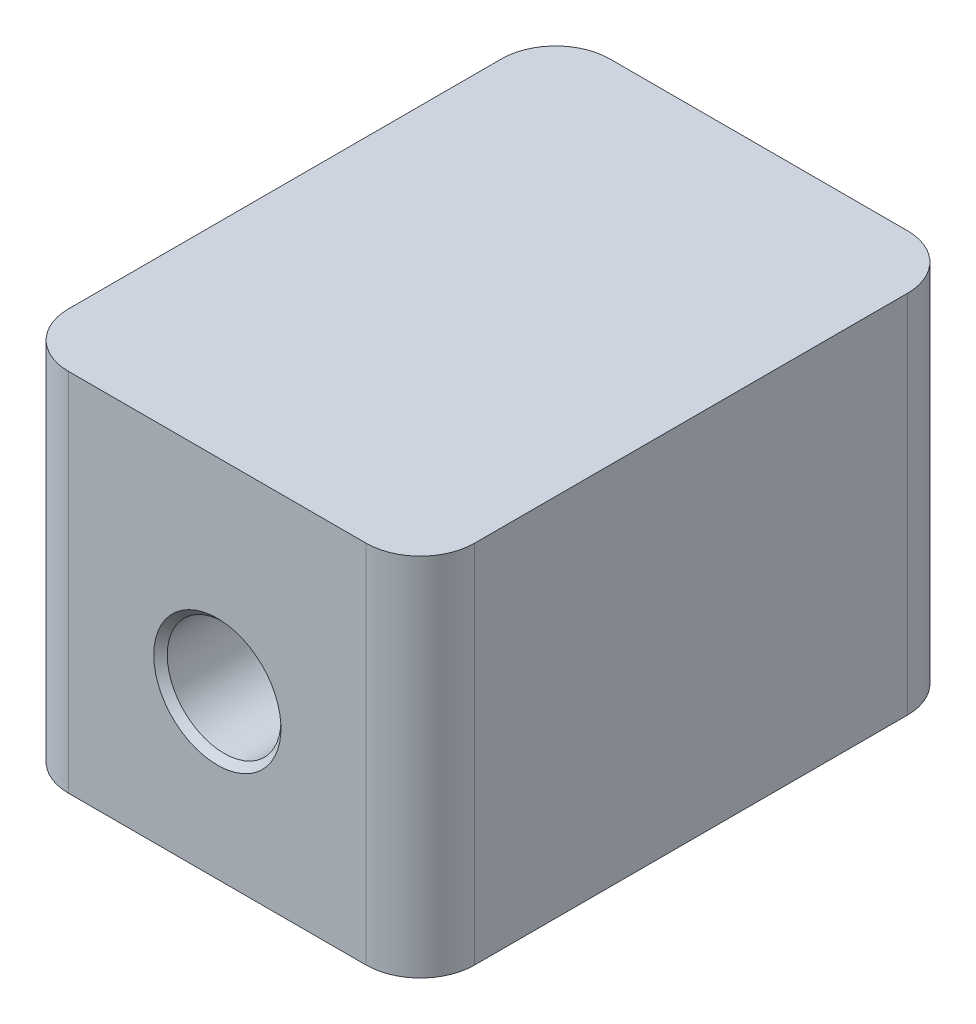
ISO-10303-21;
HEADER;
FILE_DESCRIPTION(('STEP AP214'),'2;1');
FILE_NAME('part.step','',(''),(''),'','','');
FILE_SCHEMA(('AUTOMOTIVE_DESIGN { 1 0 10303 214 1 1 1 1 }'));
ENDSEC;
DATA;
#1=APPLICATION_CONTEXT('core data for automotive mechanical design processes');
#2=APPLICATION_PROTOCOL_DEFINITION('international standard','automotive_design',2000,#1);
#3=PRODUCT_CONTEXT('',#1,'mechanical');
#4=PRODUCT('Part','Part','',(#3));
#5=PRODUCT_RELATED_PRODUCT_CATEGORY('part','',(#4));
#6=PRODUCT_DEFINITION_FORMATION('','',#4);
#7=PRODUCT_DEFINITION_CONTEXT('part definition',#1,'design');
#8=PRODUCT_DEFINITION('design','',#6,#7);
#9=PRODUCT_DEFINITION_SHAPE('','',#8);
#10=(LENGTH_UNIT() NAMED_UNIT(*) SI_UNIT(.MILLI.,.METRE.));
#11=(NAMED_UNIT(*) PLANE_ANGLE_UNIT() SI_UNIT($,.RADIAN.));
#12=(NAMED_UNIT(*) SI_UNIT($,.STERADIAN.) SOLID_ANGLE_UNIT());
#13=UNCERTAINTY_MEASURE_WITH_UNIT(LENGTH_MEASURE(1.E-05),#10,'distance_accuracy_value','');
#14=(GEOMETRIC_REPRESENTATION_CONTEXT(3) GLOBAL_UNCERTAINTY_ASSIGNED_CONTEXT((#13)) GLOBAL_UNIT_ASSIGNED_CONTEXT((#10,
#11,#12)) REPRESENTATION_CONTEXT('',''));
#15=CARTESIAN_POINT('',(0.,0.,0.));
#16=DIRECTION('',(0.,0.,1.));
#17=DIRECTION('',(1.,0.,0.));
#18=AXIS2_PLACEMENT_3D('',#15,#16,#17);
#19=CARTESIAN_POINT('',(7.5,-6.,10.));
#20=DIRECTION('',(-1.,0.,0.));
#21=DIRECTION('',(0.,0.,1.));
#22=AXIS2_PLACEMENT_3D('',#19,#20,#21);
#23=PLANE('',#22);
#24=DIRECTION('',(0.,0.,-1.));
#25=VECTOR('',#24,1.);
#26=CARTESIAN_POINT('',(7.5,-6.,10.));
#27=LINE('',#26,#25);
#28=CARTESIAN_POINT('',(7.5,-6.,8.));
#29=VERTEX_POINT('',#28);
#30=CARTESIAN_POINT('',(7.5,-6.,-8.));
#31=VERTEX_POINT('',#30);
#32=EDGE_CURVE('E124',#29,#31,#27,.T.);
#33=ORIENTED_EDGE('',*,*,#32,.T.);
#34=DIRECTION('',(0.,1.,0.));
#35=VECTOR('',#34,1.);
#36=CARTESIAN_POINT('',(7.5,7.5,-8.));
#37=LINE('',#36,#35);
#38=CARTESIAN_POINT('',(7.5,7.5,-8.));
#39=VERTEX_POINT('',#38);
#40=EDGE_CURVE('E151',#31,#39,#37,.T.);
#41=ORIENTED_EDGE('',*,*,#40,.T.);
#42=DIRECTION('',(0.,0.,-1.));
#43=VECTOR('',#42,1.);
#44=CARTESIAN_POINT('',(7.5,7.5,10.));
#45=LINE('',#44,#43);
#46=CARTESIAN_POINT('',(7.5,7.5,8.));
#47=VERTEX_POINT('',#46);
#48=EDGE_CURVE('E129',#47,#39,#45,.T.);
#49=ORIENTED_EDGE('',*,*,#48,.F.);
#50=DIRECTION('',(0.,1.,0.));
#51=VECTOR('',#50,1.);
#52=CARTESIAN_POINT('',(7.5,-6.,8.));
#53=LINE('',#52,#51);
#54=EDGE_CURVE('E149',#47,#29,#53,.F.);
#55=ORIENTED_EDGE('',*,*,#54,.T.);
#56=EDGE_LOOP('',(#33,#41,#49,#55));
#57=FACE_BOUND('',#56,.T.);
#58=ADVANCED_FACE('F36',(#57),#23,.F.);
#59=CARTESIAN_POINT('',(-7.5,7.5,10.));
#60=DIRECTION('',(0.,-1.,0.));
#61=DIRECTION('',(0.,0.,-1.));
#62=AXIS2_PLACEMENT_3D('',#59,#60,#61);
#63=PLANE('',#62);
#64=DIRECTION('',(-1.,0.,0.));
#65=VECTOR('',#64,1.);
#66=CARTESIAN_POINT('',(-7.5,7.5,-10.));
#67=LINE('',#66,#65);
#68=CARTESIAN_POINT('',(5.5,7.5,-10.));
#69=VERTEX_POINT('',#68);
#70=CARTESIAN_POINT('',(-5.5,7.5,-10.));
#71=VERTEX_POINT('',#70);
#72=EDGE_CURVE('E206',#69,#71,#67,.T.);
#73=ORIENTED_EDGE('',*,*,#72,.T.);
#74=CARTESIAN_POINT('',(-5.5,7.5,-8.));
#75=DIRECTION('',(0.,-1.,0.));
#76=DIRECTION('',(0.,0.,-1.));
#77=AXIS2_PLACEMENT_3D('',#74,#75,#76);
#78=CIRCLE('',#77,2.);
#79=CARTESIAN_POINT('',(-7.5,7.5,-8.));
#80=VERTEX_POINT('',#79);
#81=EDGE_CURVE('E147',#71,#80,#78,.F.);
#82=ORIENTED_EDGE('',*,*,#81,.T.);
#83=DIRECTION('',(0.,0.,-1.));
#84=VECTOR('',#83,1.);
#85=CARTESIAN_POINT('',(-7.5,7.5,10.));
#86=LINE('',#85,#84);
#87=CARTESIAN_POINT('',(-7.5,7.5,8.));
#88=VERTEX_POINT('',#87);
#89=EDGE_CURVE('E123',#88,#80,#86,.T.);
#90=ORIENTED_EDGE('',*,*,#89,.F.);
#91=CARTESIAN_POINT('',(-5.5,7.5,8.));
#92=DIRECTION('',(0.,-1.,0.));
#93=DIRECTION('',(0.,0.,-1.));
#94=AXIS2_PLACEMENT_3D('',#91,#92,#93);
#95=CIRCLE('',#94,2.);
#96=CARTESIAN_POINT('',(-5.5,7.5,10.));
#97=VERTEX_POINT('',#96);
#98=EDGE_CURVE('E128',#88,#97,#95,.F.);
#99=ORIENTED_EDGE('',*,*,#98,.T.);
#100=DIRECTION('',(-1.,0.,0.));
#101=VECTOR('',#100,1.);
#102=CARTESIAN_POINT('',(-7.5,7.5,10.));
#103=LINE('',#102,#101);
#104=CARTESIAN_POINT('',(5.5,7.5,10.));
#105=VERTEX_POINT('',#104);
#106=EDGE_CURVE('E207',#105,#97,#103,.T.);
#107=ORIENTED_EDGE('',*,*,#106,.F.);
#108=CARTESIAN_POINT('',(5.5,7.5,8.));
#109=DIRECTION('',(0.,-1.,0.));
#110=DIRECTION('',(0.,0.,-1.));
#111=AXIS2_PLACEMENT_3D('',#108,#109,#110);
#112=CIRCLE('',#111,2.);
#113=EDGE_CURVE('E59',#105,#47,#112,.F.);
#114=ORIENTED_EDGE('',*,*,#113,.T.);
#115=ORIENTED_EDGE('',*,*,#48,.T.);
#116=CARTESIAN_POINT('',(5.5,7.5,-8.));
#117=DIRECTION('',(0.,-1.,0.));
#118=DIRECTION('',(0.,0.,-1.));
#119=AXIS2_PLACEMENT_3D('',#116,#117,#118);
#120=CIRCLE('',#119,2.);
#121=EDGE_CURVE('E51',#39,#69,#120,.F.);
#122=ORIENTED_EDGE('',*,*,#121,.T.);
#123=EDGE_LOOP('',(#73,#82,#90,#99,#107,#114,#115,#122));
#124=FACE_BOUND('',#123,.T.);
#125=ADVANCED_FACE('F236',(#124),#63,.F.);
#126=CARTESIAN_POINT('',(-7.5,-6.,10.));
#127=DIRECTION('',(1.,0.,0.));
#128=DIRECTION('',(0.,0.,-1.));
#129=AXIS2_PLACEMENT_3D('',#126,#127,#128);
#130=PLANE('',#129);
#131=ORIENTED_EDGE('',*,*,#89,.T.);
#132=DIRECTION('',(0.,-1.,0.));
#133=VECTOR('',#132,1.);
#134=CARTESIAN_POINT('',(-7.5,-6.,-8.));
#135=LINE('',#134,#133);
#136=CARTESIAN_POINT('',(-7.5,-6.,-8.));
#137=VERTEX_POINT('',#136);
#138=EDGE_CURVE('E114',#80,#137,#135,.T.);
#139=ORIENTED_EDGE('',*,*,#138,.T.);
#140=DIRECTION('',(0.,0.,-1.));
#141=VECTOR('',#140,1.);
#142=CARTESIAN_POINT('',(-7.5,-6.,10.));
#143=LINE('',#142,#141);
#144=CARTESIAN_POINT('',(-7.5,-6.,8.));
#145=VERTEX_POINT('',#144);
#146=EDGE_CURVE('E106',#145,#137,#143,.T.);
#147=ORIENTED_EDGE('',*,*,#146,.F.);
#148=DIRECTION('',(0.,-1.,0.));
#149=VECTOR('',#148,1.);
#150=CARTESIAN_POINT('',(-7.5,-6.,8.));
#151=LINE('',#150,#149);
#152=EDGE_CURVE('E120',#145,#88,#151,.F.);
#153=ORIENTED_EDGE('',*,*,#152,.T.);
#154=EDGE_LOOP('',(#131,#139,#147,#153));
#155=FACE_BOUND('',#154,.T.);
#156=ADVANCED_FACE('F119',(#155),#130,.F.);
#157=CARTESIAN_POINT('',(-7.5,-6.,10.));
#158=DIRECTION('',(0.,1.,0.));
#159=DIRECTION('',(0.,0.,1.));
#160=AXIS2_PLACEMENT_3D('',#157,#158,#159);
#161=PLANE('',#160);
#162=CARTESIAN_POINT('',(5.5,-6.,0.));
#163=DIRECTION('',(0.,1.,0.));
#164=DIRECTION('',(0.,0.,1.));
#165=AXIS2_PLACEMENT_3D('',#162,#163,#164);
#166=CIRCLE('',#165,1.4);
#167=CARTESIAN_POINT('',(5.5,-6.,1.4));
#168=VERTEX_POINT('',#167);
#169=EDGE_CURVE('E44',#168,#168,#166,.T.);
#170=ORIENTED_EDGE('',*,*,#169,.T.);
#171=EDGE_LOOP('',(#170));
#172=FACE_BOUND('',#171,.T.);
#173=CARTESIAN_POINT('',(-5.5,-6.,0.));
#174=DIRECTION('',(0.,1.,0.));
#175=DIRECTION('',(0.,0.,1.));
#176=AXIS2_PLACEMENT_3D('',#173,#174,#175);
#177=CIRCLE('',#176,1.4);
#178=CARTESIAN_POINT('',(-5.5,-6.,1.4));
#179=VERTEX_POINT('',#178);
#180=EDGE_CURVE('E173',#179,#179,#177,.T.);
#181=ORIENTED_EDGE('',*,*,#180,.T.);
#182=EDGE_LOOP('',(#181));
#183=FACE_BOUND('',#182,.T.);
#184=ORIENTED_EDGE('',*,*,#146,.T.);
#185=CARTESIAN_POINT('',(-5.5,-6.,-8.));
#186=DIRECTION('',(0.,1.,0.));
#187=DIRECTION('',(0.,0.,1.));
#188=AXIS2_PLACEMENT_3D('',#185,#186,#187);
#189=CIRCLE('',#188,2.);
#190=CARTESIAN_POINT('',(-5.5,-6.,-10.));
#191=VERTEX_POINT('',#190);
#192=EDGE_CURVE('E138',#137,#191,#189,.F.);
#193=ORIENTED_EDGE('',*,*,#192,.T.);
#194=DIRECTION('',(1.,0.,0.));
#195=VECTOR('',#194,1.);
#196=CARTESIAN_POINT('',(-7.5,-6.,-10.));
#197=LINE('',#196,#195);
#198=CARTESIAN_POINT('',(5.5,-6.,-10.));
#199=VERTEX_POINT('',#198);
#200=EDGE_CURVE('E210',#191,#199,#197,.T.);
#201=ORIENTED_EDGE('',*,*,#200,.T.);
#202=CARTESIAN_POINT('',(5.5,-6.,-8.));
#203=DIRECTION('',(0.,1.,0.));
#204=DIRECTION('',(0.,0.,1.));
#205=AXIS2_PLACEMENT_3D('',#202,#203,#204);
#206=CIRCLE('',#205,2.);
#207=EDGE_CURVE('E136',#199,#31,#206,.F.);
#208=ORIENTED_EDGE('',*,*,#207,.T.);
#209=ORIENTED_EDGE('',*,*,#32,.F.);
#210=CARTESIAN_POINT('',(5.5,-6.,8.));
#211=DIRECTION('',(0.,1.,0.));
#212=DIRECTION('',(0.,0.,1.));
#213=AXIS2_PLACEMENT_3D('',#210,#211,#212);
#214=CIRCLE('',#213,2.);
#215=CARTESIAN_POINT('',(5.5,-6.,10.));
#216=VERTEX_POINT('',#215);
#217=EDGE_CURVE('E113',#29,#216,#214,.F.);
#218=ORIENTED_EDGE('',*,*,#217,.T.);
#219=DIRECTION('',(1.,0.,0.));
#220=VECTOR('',#219,1.);
#221=CARTESIAN_POINT('',(-7.5,-6.,10.));
#222=LINE('',#221,#220);
#223=CARTESIAN_POINT('',(-5.5,-6.,10.));
#224=VERTEX_POINT('',#223);
#225=EDGE_CURVE('E108',#224,#216,#222,.T.);
#226=ORIENTED_EDGE('',*,*,#225,.F.);
#227=CARTESIAN_POINT('',(-5.5,-6.,8.));
#228=DIRECTION('',(0.,1.,0.));
#229=DIRECTION('',(0.,0.,1.));
#230=AXIS2_PLACEMENT_3D('',#227,#228,#229);
#231=CIRCLE('',#230,2.);
#232=EDGE_CURVE('E103',#224,#145,#231,.F.);
#233=ORIENTED_EDGE('',*,*,#232,.T.);
#234=EDGE_LOOP('',(#184,#193,#201,#208,#209,#218,#226,#233));
#235=FACE_BOUND('',#234,.T.);
#236=ADVANCED_FACE('F105',(#172,#183,#235),#161,.F.);
#237=CARTESIAN_POINT('',(0.,0.,10.));
#238=DIRECTION('',(0.,0.,-1.));
#239=DIRECTION('',(-1.,0.,0.));
#240=AXIS2_PLACEMENT_3D('',#237,#238,#239);
#241=PLANE('',#240);
#242=CARTESIAN_POINT('',(0.,0.,10.));
#243=DIRECTION('',(0.,0.,-1.));
#244=DIRECTION('',(-1.,0.,0.));
#245=AXIS2_PLACEMENT_3D('',#242,#243,#244);
#246=CIRCLE('',#245,2.35);
#247=CARTESIAN_POINT('',(-2.35,0.,10.));
#248=VERTEX_POINT('',#247);
#249=EDGE_CURVE('E167',#248,#248,#246,.T.);
#250=ORIENTED_EDGE('',*,*,#249,.T.);
#251=EDGE_LOOP('',(#250));
#252=FACE_BOUND('',#251,.T.);
#253=ORIENTED_EDGE('',*,*,#225,.T.);
#254=DIRECTION('',(0.,1.,0.));
#255=VECTOR('',#254,1.);
#256=CARTESIAN_POINT('',(5.5,0.,10.));
#257=LINE('',#256,#255);
#258=EDGE_CURVE('E155',#216,#105,#257,.T.);
#259=ORIENTED_EDGE('',*,*,#258,.T.);
#260=ORIENTED_EDGE('',*,*,#106,.T.);
#261=DIRECTION('',(0.,-1.,0.));
#262=VECTOR('',#261,1.);
#263=CARTESIAN_POINT('',(-5.5,0.,10.));
#264=LINE('',#263,#262);
#265=EDGE_CURVE('E153',#97,#224,#264,.T.);
#266=ORIENTED_EDGE('',*,*,#265,.T.);
#267=EDGE_LOOP('',(#253,#259,#260,#266));
#268=FACE_BOUND('',#267,.T.);
#269=ADVANCED_FACE('F235',(#252,#268),#241,.F.);
#270=CARTESIAN_POINT('',(0.,0.,-10.));
#271=DIRECTION('',(0.,0.,-1.));
#272=DIRECTION('',(-1.,0.,0.));
#273=AXIS2_PLACEMENT_3D('',#270,#271,#272);
#274=PLANE('',#273);
#275=CARTESIAN_POINT('',(0.,0.,-10.));
#276=DIRECTION('',(0.,0.,-1.));
#277=DIRECTION('',(-1.,0.,0.));
#278=AXIS2_PLACEMENT_3D('',#275,#276,#277);
#279=CIRCLE('',#278,2.35);
#280=CARTESIAN_POINT('',(-2.35,0.,-10.));
#281=VERTEX_POINT('',#280);
#282=EDGE_CURVE('E161',#281,#281,#279,.F.);
#283=ORIENTED_EDGE('',*,*,#282,.T.);
#284=EDGE_LOOP('',(#283));
#285=FACE_BOUND('',#284,.T.);
#286=ORIENTED_EDGE('',*,*,#200,.F.);
#287=DIRECTION('',(0.,-1.,0.));
#288=VECTOR('',#287,1.);
#289=CARTESIAN_POINT('',(-5.5,7.5,-10.));
#290=LINE('',#289,#288);
#291=EDGE_CURVE('E142',#191,#71,#290,.F.);
#292=ORIENTED_EDGE('',*,*,#291,.T.);
#293=ORIENTED_EDGE('',*,*,#72,.F.);
#294=DIRECTION('',(0.,1.,0.));
#295=VECTOR('',#294,1.);
#296=CARTESIAN_POINT('',(5.5,-6.,-10.));
#297=LINE('',#296,#295);
#298=EDGE_CURVE('E140',#69,#199,#297,.F.);
#299=ORIENTED_EDGE('',*,*,#298,.T.);
#300=EDGE_LOOP('',(#286,#292,#293,#299));
#301=FACE_BOUND('',#300,.T.);
#302=ADVANCED_FACE('F224',(#285,#301),#274,.T.);
#303=CARTESIAN_POINT('',(-5.5,-6.,-8.));
#304=DIRECTION('',(0.,1.,0.));
#305=DIRECTION('',(0.,0.,1.));
#306=AXIS2_PLACEMENT_3D('',#303,#304,#305);
#307=CYLINDRICAL_SURFACE('',#306,2.);
#308=ORIENTED_EDGE('',*,*,#81,.F.);
#309=ORIENTED_EDGE('',*,*,#291,.F.);
#310=ORIENTED_EDGE('',*,*,#192,.F.);
#311=ORIENTED_EDGE('',*,*,#138,.F.);
#312=EDGE_LOOP('',(#308,#309,#310,#311));
#313=FACE_BOUND('',#312,.T.);
#314=ADVANCED_FACE('F219',(#313),#307,.T.);
#315=CARTESIAN_POINT('',(5.5,-6.,-8.));
#316=DIRECTION('',(0.,-1.,0.));
#317=DIRECTION('',(0.,0.,-1.));
#318=AXIS2_PLACEMENT_3D('',#315,#316,#317);
#319=CYLINDRICAL_SURFACE('',#318,2.);
#320=ORIENTED_EDGE('',*,*,#207,.F.);
#321=ORIENTED_EDGE('',*,*,#298,.F.);
#322=ORIENTED_EDGE('',*,*,#121,.F.);
#323=ORIENTED_EDGE('',*,*,#40,.F.);
#324=EDGE_LOOP('',(#320,#321,#322,#323));
#325=FACE_BOUND('',#324,.T.);
#326=ADVANCED_FACE('F226',(#325),#319,.T.);
#327=CARTESIAN_POINT('',(5.5,0.,8.));
#328=DIRECTION('',(0.,1.,0.));
#329=DIRECTION('',(0.,0.,1.));
#330=AXIS2_PLACEMENT_3D('',#327,#328,#329);
#331=CYLINDRICAL_SURFACE('',#330,2.);
#332=ORIENTED_EDGE('',*,*,#217,.F.);
#333=ORIENTED_EDGE('',*,*,#54,.F.);
#334=ORIENTED_EDGE('',*,*,#113,.F.);
#335=ORIENTED_EDGE('',*,*,#258,.F.);
#336=EDGE_LOOP('',(#332,#333,#334,#335));
#337=FACE_BOUND('',#336,.T.);
#338=ADVANCED_FACE('F232',(#337),#331,.T.);
#339=CARTESIAN_POINT('',(-5.5,0.,8.));
#340=DIRECTION('',(0.,-1.,0.));
#341=DIRECTION('',(0.,0.,-1.));
#342=AXIS2_PLACEMENT_3D('',#339,#340,#341);
#343=CYLINDRICAL_SURFACE('',#342,2.);
#344=ORIENTED_EDGE('',*,*,#98,.F.);
#345=ORIENTED_EDGE('',*,*,#152,.F.);
#346=ORIENTED_EDGE('',*,*,#232,.F.);
#347=ORIENTED_EDGE('',*,*,#265,.F.);
#348=EDGE_LOOP('',(#344,#345,#346,#347));
#349=FACE_BOUND('',#348,.T.);
#350=ADVANCED_FACE('F127',(#349),#343,.T.);
#351=CARTESIAN_POINT('',(0.,0.,-4.99999999999999));
#352=DIRECTION('',(0.,0.,1.));
#353=DIRECTION('',(1.,0.,0.));
#354=AXIS2_PLACEMENT_3D('',#351,#352,#353);
#355=PLANE('',#354);
#356=CARTESIAN_POINT('',(0.,0.,-5.));
#357=DIRECTION('',(0.,0.,-1.));
#358=DIRECTION('',(-1.,0.,0.));
#359=AXIS2_PLACEMENT_3D('',#356,#357,#358);
#360=CIRCLE('',#359,2.1);
#361=CARTESIAN_POINT('',(-2.1,0.,-5.));
#362=VERTEX_POINT('',#361);
#363=EDGE_CURVE('E203',#362,#362,#360,.T.);
#364=ORIENTED_EDGE('',*,*,#363,.T.);
#365=EDGE_LOOP('',(#364));
#366=FACE_BOUND('',#365,.T.);
#367=ADVANCED_FACE('F255',(#366),#355,.F.);
#368=CARTESIAN_POINT('',(0.,0.,-10.));
#369=DIRECTION('',(0.,0.,-1.));
#370=DIRECTION('',(-1.,0.,0.));
#371=AXIS2_PLACEMENT_3D('',#368,#369,#370);
#372=CYLINDRICAL_SURFACE('',#371,2.1);
#373=CARTESIAN_POINT('',(0.,0.,-9.75));
#374=DIRECTION('',(0.,0.,-1.));
#375=DIRECTION('',(-1.,0.,0.));
#376=AXIS2_PLACEMENT_3D('',#373,#374,#375);
#377=CIRCLE('',#376,2.1);
#378=CARTESIAN_POINT('',(-2.1,0.,-9.75));
#379=VERTEX_POINT('',#378);
#380=EDGE_CURVE('E158',#379,#379,#377,.T.);
#381=ORIENTED_EDGE('',*,*,#380,.T.);
#382=EDGE_LOOP('',(#381));
#383=FACE_BOUND('',#382,.T.);
#384=ORIENTED_EDGE('',*,*,#363,.F.);
#385=EDGE_LOOP('',(#384));
#386=FACE_BOUND('',#385,.T.);
#387=ADVANCED_FACE('F281',(#383,#386),#372,.F.);
#388=CARTESIAN_POINT('',(0.,0.,4.99999999999999));
#389=DIRECTION('',(0.,0.,-1.));
#390=DIRECTION('',(-1.,0.,0.));
#391=AXIS2_PLACEMENT_3D('',#388,#389,#390);
#392=PLANE('',#391);
#393=CARTESIAN_POINT('',(0.,0.,5.));
#394=DIRECTION('',(0.,0.,1.));
#395=DIRECTION('',(1.,0.,0.));
#396=AXIS2_PLACEMENT_3D('',#393,#394,#395);
#397=CIRCLE('',#396,2.1);
#398=CARTESIAN_POINT('',(2.1,0.,5.));
#399=VERTEX_POINT('',#398);
#400=EDGE_CURVE('E198',#399,#399,#397,.T.);
#401=ORIENTED_EDGE('',*,*,#400,.T.);
#402=EDGE_LOOP('',(#401));
#403=FACE_BOUND('',#402,.T.);
#404=ADVANCED_FACE('F276',(#403),#392,.F.);
#405=CARTESIAN_POINT('',(0.,0.,10.));
#406=DIRECTION('',(0.,0.,1.));
#407=DIRECTION('',(1.,0.,0.));
#408=AXIS2_PLACEMENT_3D('',#405,#406,#407);
#409=CYLINDRICAL_SURFACE('',#408,2.1);
#410=CARTESIAN_POINT('',(0.,0.,9.75));
#411=DIRECTION('',(0.,0.,-1.));
#412=DIRECTION('',(-1.,0.,0.));
#413=AXIS2_PLACEMENT_3D('',#410,#411,#412);
#414=CIRCLE('',#413,2.1);
#415=CARTESIAN_POINT('',(-2.1,0.,9.75));
#416=VERTEX_POINT('',#415);
#417=EDGE_CURVE('E164',#416,#416,#414,.F.);
#418=ORIENTED_EDGE('',*,*,#417,.T.);
#419=EDGE_LOOP('',(#418));
#420=FACE_BOUND('',#419,.T.);
#421=ORIENTED_EDGE('',*,*,#400,.F.);
#422=EDGE_LOOP('',(#421));
#423=FACE_BOUND('',#422,.T.);
#424=ADVANCED_FACE('F260',(#420,#423),#409,.F.);
#425=CARTESIAN_POINT('',(0.,0.,-9.75));
#426=DIRECTION('',(0.,0.,-1.));
#427=DIRECTION('',(-1.,0.,0.));
#428=AXIS2_PLACEMENT_3D('',#425,#426,#427);
#429=CONICAL_SURFACE('',#428,2.1,0.785398163397452);
#430=ORIENTED_EDGE('',*,*,#282,.F.);
#431=EDGE_LOOP('',(#430));
#432=FACE_BOUND('',#431,.T.);
#433=ORIENTED_EDGE('',*,*,#380,.F.);
#434=EDGE_LOOP('',(#433));
#435=FACE_BOUND('',#434,.T.);
#436=ADVANCED_FACE('F256',(#432,#435),#429,.F.);
#437=CARTESIAN_POINT('',(0.,0.,9.75));
#438=DIRECTION('',(0.,0.,1.));
#439=DIRECTION('',(1.,0.,0.));
#440=AXIS2_PLACEMENT_3D('',#437,#438,#439);
#441=CONICAL_SURFACE('',#440,2.1,0.785398163397452);
#442=ORIENTED_EDGE('',*,*,#249,.F.);
#443=EDGE_LOOP('',(#442));
#444=FACE_BOUND('',#443,.T.);
#445=ORIENTED_EDGE('',*,*,#417,.F.);
#446=EDGE_LOOP('',(#445));
#447=FACE_BOUND('',#446,.T.);
#448=ADVANCED_FACE('F259',(#444,#447),#441,.F.);
#449=CARTESIAN_POINT('',(-5.5,-2.,0.));
#450=DIRECTION('',(0.,-1.,0.));
#451=DIRECTION('',(0.,0.,-1.));
#452=AXIS2_PLACEMENT_3D('',#449,#450,#451);
#453=CYLINDRICAL_SURFACE('',#452,1.25);
#454=CARTESIAN_POINT('',(-5.5,-5.85,0.));
#455=DIRECTION('',(0.,1.,0.));
#456=DIRECTION('',(0.,0.,1.));
#457=AXIS2_PLACEMENT_3D('',#454,#455,#456);
#458=CIRCLE('',#457,1.25);
#459=CARTESIAN_POINT('',(-5.5,-5.85,1.25));
#460=VERTEX_POINT('',#459);
#461=EDGE_CURVE('E11',#460,#460,#458,.F.);
#462=ORIENTED_EDGE('',*,*,#461,.T.);
#463=EDGE_LOOP('',(#462));
#464=FACE_BOUND('',#463,.T.);
#465=CARTESIAN_POINT('',(-5.5,-2.,0.));
#466=DIRECTION('',(0.,-1.,0.));
#467=DIRECTION('',(0.,0.,-1.));
#468=AXIS2_PLACEMENT_3D('',#465,#466,#467);
#469=CIRCLE('',#468,1.25);
#470=CARTESIAN_POINT('',(-5.5,-2.,-1.25));
#471=VERTEX_POINT('',#470);
#472=EDGE_CURVE('E195',#471,#471,#469,.T.);
#473=ORIENTED_EDGE('',*,*,#472,.F.);
#474=EDGE_LOOP('',(#473));
#475=FACE_BOUND('',#474,.T.);
#476=ADVANCED_FACE('F263',(#464,#475),#453,.F.);
#477=CARTESIAN_POINT('',(-5.5,-2.,0.));
#478=DIRECTION('',(0.,-1.,0.));
#479=DIRECTION('',(0.,0.,-1.));
#480=AXIS2_PLACEMENT_3D('',#477,#478,#479);
#481=PLANE('',#480);
#482=ORIENTED_EDGE('',*,*,#472,.T.);
#483=EDGE_LOOP('',(#482));
#484=FACE_BOUND('',#483,.T.);
#485=ADVANCED_FACE('F189',(#484),#481,.T.);
#486=CARTESIAN_POINT('',(5.5,-2.,0.));
#487=DIRECTION('',(0.,-1.,0.));
#488=DIRECTION('',(0.,0.,-1.));
#489=AXIS2_PLACEMENT_3D('',#486,#487,#488);
#490=CYLINDRICAL_SURFACE('',#489,1.25);
#491=CARTESIAN_POINT('',(5.5,-5.85,0.));
#492=DIRECTION('',(0.,1.,0.));
#493=DIRECTION('',(0.,0.,1.));
#494=AXIS2_PLACEMENT_3D('',#491,#492,#493);
#495=CIRCLE('',#494,1.25);
#496=CARTESIAN_POINT('',(5.5,-5.85,1.25));
#497=VERTEX_POINT('',#496);
#498=EDGE_CURVE('E170',#497,#497,#495,.F.);
#499=ORIENTED_EDGE('',*,*,#498,.T.);
#500=EDGE_LOOP('',(#499));
#501=FACE_BOUND('',#500,.T.);
#502=CARTESIAN_POINT('',(5.5,-2.,0.));
#503=DIRECTION('',(0.,-1.,0.));
#504=DIRECTION('',(0.,0.,-1.));
#505=AXIS2_PLACEMENT_3D('',#502,#503,#504);
#506=CIRCLE('',#505,1.25);
#507=CARTESIAN_POINT('',(5.5,-2.,-1.25));
#508=VERTEX_POINT('',#507);
#509=EDGE_CURVE('E193',#508,#508,#506,.T.);
#510=ORIENTED_EDGE('',*,*,#509,.F.);
#511=EDGE_LOOP('',(#510));
#512=FACE_BOUND('',#511,.T.);
#513=ADVANCED_FACE('F186',(#501,#512),#490,.F.);
#514=CARTESIAN_POINT('',(5.5,-2.,0.));
#515=DIRECTION('',(0.,-1.,0.));
#516=DIRECTION('',(0.,0.,-1.));
#517=AXIS2_PLACEMENT_3D('',#514,#515,#516);
#518=PLANE('',#517);
#519=ORIENTED_EDGE('',*,*,#509,.T.);
#520=EDGE_LOOP('',(#519));
#521=FACE_BOUND('',#520,.T.);
#522=ADVANCED_FACE('F183',(#521),#518,.T.);
#523=CARTESIAN_POINT('',(5.5,-5.85,0.));
#524=DIRECTION('',(0.,-1.,0.));
#525=DIRECTION('',(0.,0.,-1.));
#526=AXIS2_PLACEMENT_3D('',#523,#524,#525);
#527=CONICAL_SURFACE('',#526,1.25,0.785398163397449);
#528=ORIENTED_EDGE('',*,*,#169,.F.);
#529=EDGE_LOOP('',(#528));
#530=FACE_BOUND('',#529,.T.);
#531=ORIENTED_EDGE('',*,*,#498,.F.);
#532=EDGE_LOOP('',(#531));
#533=FACE_BOUND('',#532,.T.);
#534=ADVANCED_FACE('F180',(#530,#533),#527,.F.);
#535=CARTESIAN_POINT('',(-5.5,-5.85,0.));
#536=DIRECTION('',(0.,-1.,0.));
#537=DIRECTION('',(0.,0.,-1.));
#538=AXIS2_PLACEMENT_3D('',#535,#536,#537);
#539=CONICAL_SURFACE('',#538,1.25,0.785398163397449);
#540=ORIENTED_EDGE('',*,*,#180,.F.);
#541=EDGE_LOOP('',(#540));
#542=FACE_BOUND('',#541,.T.);
#543=ORIENTED_EDGE('',*,*,#461,.F.);
#544=EDGE_LOOP('',(#543));
#545=FACE_BOUND('',#544,.T.);
#546=ADVANCED_FACE('F38',(#542,#545),#539,.F.);
#547=CLOSED_SHELL('',(#58,#125,#156,#236,#269,#302,#314,#326,#338,#350,#367,#387,#404,#424,#436,
#448,#476,#485,#513,#522,#534,#546));
#548=MANIFOLD_SOLID_BREP('B2',#547);
#549=ADVANCED_BREP_SHAPE_REPRESENTATION('',(#18,#548),#14);
#550=SHAPE_DEFINITION_REPRESENTATION(#9,#549);
ENDSEC;
END-ISO-10303-21;
